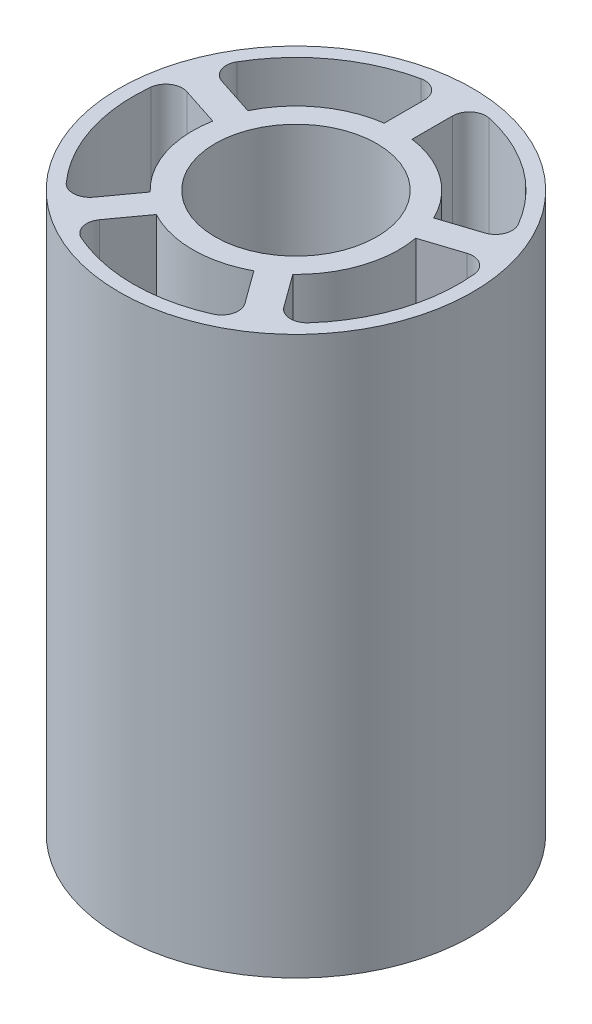
ISO-10303-21;
HEADER;
FILE_DESCRIPTION(('STEP AP214'),'2;1');
FILE_NAME('part.step','',(''),(''),'','','');
FILE_SCHEMA(('AUTOMOTIVE_DESIGN { 1 0 10303 214 1 1 1 1 }'));
ENDSEC;
DATA;
#1=APPLICATION_CONTEXT('core data for automotive mechanical design processes');
#2=APPLICATION_PROTOCOL_DEFINITION('international standard','automotive_design',2000,#1);
#3=PRODUCT_CONTEXT('',#1,'mechanical');
#4=PRODUCT('Part','Part','',(#3));
#5=PRODUCT_RELATED_PRODUCT_CATEGORY('part','',(#4));
#6=PRODUCT_DEFINITION_FORMATION('','',#4);
#7=PRODUCT_DEFINITION_CONTEXT('part definition',#1,'design');
#8=PRODUCT_DEFINITION('design','',#6,#7);
#9=PRODUCT_DEFINITION_SHAPE('','',#8);
#10=(LENGTH_UNIT() NAMED_UNIT(*) SI_UNIT(.MILLI.,.METRE.));
#11=(NAMED_UNIT(*) PLANE_ANGLE_UNIT() SI_UNIT($,.RADIAN.));
#12=(NAMED_UNIT(*) SI_UNIT($,.STERADIAN.) SOLID_ANGLE_UNIT());
#13=UNCERTAINTY_MEASURE_WITH_UNIT(LENGTH_MEASURE(1.E-05),#10,'distance_accuracy_value','');
#14=(GEOMETRIC_REPRESENTATION_CONTEXT(3) GLOBAL_UNCERTAINTY_ASSIGNED_CONTEXT((#13)) GLOBAL_UNIT_ASSIGNED_CONTEXT((#10,
#11,#12)) REPRESENTATION_CONTEXT('',''));
#15=CARTESIAN_POINT('',(0.,0.,0.));
#16=DIRECTION('',(0.,0.,1.));
#17=DIRECTION('',(1.,0.,0.));
#18=AXIS2_PLACEMENT_3D('',#15,#16,#17);
#19=CARTESIAN_POINT('',(0.,100.,0.));
#20=DIRECTION('',(0.,1.,0.));
#21=DIRECTION('',(0.,0.,1.));
#22=AXIS2_PLACEMENT_3D('',#19,#20,#21);
#23=PLANE('',#22);
#24=CARTESIAN_POINT('',(0.,100.,0.));
#25=DIRECTION('',(0.,1.,0.));
#26=DIRECTION('',(0.,0.,1.));
#27=AXIS2_PLACEMENT_3D('',#24,#25,#26);
#28=CIRCLE('',#27,31.685);
#29=CARTESIAN_POINT('',(0.,100.,31.685));
#30=VERTEX_POINT('',#29);
#31=EDGE_CURVE('E11',#30,#30,#28,.T.);
#32=ORIENTED_EDGE('',*,*,#31,.T.);
#33=EDGE_LOOP('',(#32));
#34=FACE_BOUND('',#33,.T.);
#35=CARTESIAN_POINT('',(0.,100.,0.));
#36=DIRECTION('',(0.,1.,0.));
#37=DIRECTION('',(0.,0.,1.));
#38=AXIS2_PLACEMENT_3D('',#35,#36,#37);
#39=CIRCLE('',#38,14.5);
#40=CARTESIAN_POINT('',(0.,100.,14.5));
#41=VERTEX_POINT('',#40);
#42=EDGE_CURVE('E461',#41,#41,#39,.T.);
#43=ORIENTED_EDGE('',*,*,#42,.F.);
#44=EDGE_LOOP('',(#43));
#45=FACE_BOUND('',#44,.T.);
#46=DIRECTION('',(0.951056516295153,0.,-0.309016994374948));
#47=VECTOR('',#46,1.);
#48=CARTESIAN_POINT('',(23.5753258110013,100.,-10.288743261698));
#49=LINE('',#48,#47);
#50=CARTESIAN_POINT('',(16.6606114184768,100.,-8.04201636174165));
#51=VERTEX_POINT('',#50);
#52=CARTESIAN_POINT('',(23.5753258110013,100.,-10.288743261698));
#53=VERTEX_POINT('',#52);
#54=EDGE_CURVE('E418',#51,#53,#49,.T.);
#55=ORIENTED_EDGE('',*,*,#54,.F.);
#56=CARTESIAN_POINT('',(0.,100.,0.));
#57=DIRECTION('',(0.,-1.,0.));
#58=DIRECTION('',(0.,0.,1.));
#59=AXIS2_PLACEMENT_3D('',#56,#57,#58);
#60=CIRCLE('',#59,18.5);
#61=CARTESIAN_POINT('',(2.5,100.,-18.3303027798234));
#62=VERTEX_POINT('',#61);
#63=EDGE_CURVE('E416',#62,#51,#60,.T.);
#64=ORIENTED_EDGE('',*,*,#63,.F.);
#65=DIRECTION('',(0.,0.,1.));
#66=VECTOR('',#65,1.);
#67=CARTESIAN_POINT('',(2.5,100.,-25.6008637549595));
#68=LINE('',#67,#66);
#69=CARTESIAN_POINT('',(2.5,100.,-25.6008637549595));
#70=VERTEX_POINT('',#69);
#71=EDGE_CURVE('E428',#70,#62,#68,.T.);
#72=ORIENTED_EDGE('',*,*,#71,.F.);
#73=CARTESIAN_POINT('',(5.5,100.,-25.6008637549595));
#74=DIRECTION('',(0.,1.,0.));
#75=DIRECTION('',(0.,0.,1.));
#76=AXIS2_PLACEMENT_3D('',#73,#74,#75);
#77=CIRCLE('',#76,3.);
#78=CARTESIAN_POINT('',(6.13013175482146,100.,-28.5339396100246));
#79=VERTEX_POINT('',#78);
#80=EDGE_CURVE('E425',#79,#70,#77,.T.);
#81=ORIENTED_EDGE('',*,*,#80,.F.);
#82=CARTESIAN_POINT('',(0.,100.,0.));
#83=DIRECTION('',(0.,1.,0.));
#84=DIRECTION('',(0.,0.,1.));
#85=AXIS2_PLACEMENT_3D('',#82,#83,#84);
#86=CIRCLE('',#85,29.185);
#87=CARTESIAN_POINT('',(25.2430743116889,100.,-14.6475740071369));
#88=VERTEX_POINT('',#87);
#89=EDGE_CURVE('E423',#88,#79,#86,.T.);
#90=ORIENTED_EDGE('',*,*,#89,.F.);
#91=CARTESIAN_POINT('',(22.6482748278765,100.,-13.1419128105835));
#92=DIRECTION('',(0.,1.,0.));
#93=DIRECTION('',(0.,0.,1.));
#94=AXIS2_PLACEMENT_3D('',#91,#92,#93);
#95=CIRCLE('',#94,3.);
#96=EDGE_CURVE('E421',#53,#88,#95,.T.);
#97=ORIENTED_EDGE('',*,*,#96,.F.);
#98=EDGE_LOOP('',(#55,#64,#72,#81,#90,#97));
#99=FACE_BOUND('',#98,.T.);
#100=DIRECTION('',(0.,0.,-1.));
#101=VECTOR('',#100,1.);
#102=CARTESIAN_POINT('',(-2.5,100.,-25.6008637549595));
#103=LINE('',#102,#101);
#104=CARTESIAN_POINT('',(-2.5,100.,-18.3303027798234));
#105=VERTEX_POINT('',#104);
#106=CARTESIAN_POINT('',(-2.5,100.,-25.6008637549595));
#107=VERTEX_POINT('',#106);
#108=EDGE_CURVE('E373',#105,#107,#103,.T.);
#109=ORIENTED_EDGE('',*,*,#108,.F.);
#110=CARTESIAN_POINT('',(0.,100.,0.));
#111=DIRECTION('',(0.,-1.,0.));
#112=DIRECTION('',(0.,0.,1.));
#113=AXIS2_PLACEMENT_3D('',#110,#111,#112);
#114=CIRCLE('',#113,18.5);
#115=CARTESIAN_POINT('',(-16.6606114184768,100.,-8.04201636174164));
#116=VERTEX_POINT('',#115);
#117=EDGE_CURVE('E371',#116,#105,#114,.T.);
#118=ORIENTED_EDGE('',*,*,#117,.F.);
#119=DIRECTION('',(0.951056516295154,0.,0.309016994374947));
#120=VECTOR('',#119,1.);
#121=CARTESIAN_POINT('',(-23.5753258110013,100.,-10.288743261698));
#122=LINE('',#121,#120);
#123=CARTESIAN_POINT('',(-23.5753258110013,100.,-10.288743261698));
#124=VERTEX_POINT('',#123);
#125=EDGE_CURVE('E383',#124,#116,#122,.T.);
#126=ORIENTED_EDGE('',*,*,#125,.F.);
#127=CARTESIAN_POINT('',(-22.6482748278765,100.,-13.1419128105835));
#128=DIRECTION('',(0.,1.,0.));
#129=DIRECTION('',(0.,0.,-1.));
#130=AXIS2_PLACEMENT_3D('',#127,#128,#129);
#131=CIRCLE('',#130,3.);
#132=CARTESIAN_POINT('',(-25.2430743116889,100.,-14.6475740071368));
#133=VERTEX_POINT('',#132);
#134=EDGE_CURVE('E380',#133,#124,#131,.T.);
#135=ORIENTED_EDGE('',*,*,#134,.F.);
#136=CARTESIAN_POINT('',(0.,100.,0.));
#137=DIRECTION('',(0.,1.,0.));
#138=DIRECTION('',(0.,0.,1.));
#139=AXIS2_PLACEMENT_3D('',#136,#137,#138);
#140=CIRCLE('',#139,29.185);
#141=CARTESIAN_POINT('',(-6.13013175482147,100.,-28.5339396100246));
#142=VERTEX_POINT('',#141);
#143=EDGE_CURVE('E378',#142,#133,#140,.T.);
#144=ORIENTED_EDGE('',*,*,#143,.F.);
#145=CARTESIAN_POINT('',(-5.5,100.,-25.6008637549595));
#146=DIRECTION('',(0.,1.,0.));
#147=DIRECTION('',(0.,0.,-1.));
#148=AXIS2_PLACEMENT_3D('',#145,#146,#147);
#149=CIRCLE('',#148,3.);
#150=EDGE_CURVE('E376',#107,#142,#149,.T.);
#151=ORIENTED_EDGE('',*,*,#150,.F.);
#152=EDGE_LOOP('',(#109,#118,#126,#135,#144,#151));
#153=FACE_BOUND('',#152,.T.);
#154=DIRECTION('',(0.587785252292473,0.,0.809016994374947));
#155=VECTOR('',#154,1.);
#156=CARTESIAN_POINT('',(17.0703526470515,100.,19.2420707177087));
#157=LINE('',#156,#155);
#158=CARTESIAN_POINT('',(12.7968241299733,100.,13.3600633301843));
#159=VERTEX_POINT('',#158);
#160=CARTESIAN_POINT('',(17.0703526470515,100.,19.2420707177087));
#161=VERTEX_POINT('',#160);
#162=EDGE_CURVE('E328',#159,#161,#157,.T.);
#163=ORIENTED_EDGE('',*,*,#162,.F.);
#164=CARTESIAN_POINT('',(0.,100.,0.));
#165=DIRECTION('',(0.,-1.,0.));
#166=DIRECTION('',(0.,0.,1.));
#167=AXIS2_PLACEMENT_3D('',#164,#165,#166);
#168=CIRCLE('',#167,18.5);
#169=CARTESIAN_POINT('',(18.2056963903515,100.,-3.28673378026588));
#170=VERTEX_POINT('',#169);
#171=EDGE_CURVE('E326',#170,#159,#168,.T.);
#172=ORIENTED_EDGE('',*,*,#171,.F.);
#173=DIRECTION('',(-0.951056516295153,0.,0.309016994374948));
#174=VECTOR('',#173,1.);
#175=CARTESIAN_POINT('',(25.120410782876,100.,-5.53346068022224));
#176=LINE('',#175,#174);
#177=CARTESIAN_POINT('',(25.120410782876,100.,-5.53346068022224));
#178=VERTEX_POINT('',#177);
#179=EDGE_CURVE('E338',#178,#170,#176,.T.);
#180=ORIENTED_EDGE('',*,*,#179,.F.);
#181=CARTESIAN_POINT('',(26.0474617660009,100.,-2.68029113133678));
#182=DIRECTION('',(0.,1.,0.));
#183=DIRECTION('',(0.,0.,-1.));
#184=AXIS2_PLACEMENT_3D('',#181,#182,#183);
#185=CIRCLE('',#184,3.);
#186=CARTESIAN_POINT('',(29.0317040916836,100.,-2.98737050479526));
#187=VERTEX_POINT('',#186);
#188=EDGE_CURVE('E335',#187,#178,#185,.T.);
#189=ORIENTED_EDGE('',*,*,#188,.F.);
#190=CARTESIAN_POINT('',(0.,100.,0.));
#191=DIRECTION('',(0.,1.,0.));
#192=DIRECTION('',(0.,0.,1.));
#193=AXIS2_PLACEMENT_3D('',#190,#191,#192);
#194=CIRCLE('',#193,29.185);
#195=CARTESIAN_POINT('',(21.7312096599846,100.,19.4812410208845));
#196=VERTEX_POINT('',#195);
#197=EDGE_CURVE('E333',#196,#187,#194,.T.);
#198=ORIENTED_EDGE('',*,*,#197,.F.);
#199=CARTESIAN_POINT('',(19.4974036301763,100.,17.4787149608313));
#200=DIRECTION('',(0.,1.,0.));
#201=DIRECTION('',(0.,0.,1.));
#202=AXIS2_PLACEMENT_3D('',#199,#200,#201);
#203=CIRCLE('',#202,3.);
#204=EDGE_CURVE('E331',#161,#196,#203,.T.);
#205=ORIENTED_EDGE('',*,*,#204,.F.);
#206=EDGE_LOOP('',(#163,#172,#180,#189,#198,#205));
#207=FACE_BOUND('',#206,.T.);
#208=CARTESIAN_POINT('',(0.,100.,0.));
#209=DIRECTION('',(0.,1.,0.));
#210=DIRECTION('',(0.,0.,1.));
#211=AXIS2_PLACEMENT_3D('',#208,#209,#210);
#212=CIRCLE('',#211,29.185);
#213=CARTESIAN_POINT('',(-29.0317040916836,100.,-2.98737050479526));
#214=VERTEX_POINT('',#213);
#215=CARTESIAN_POINT('',(-21.7312096599846,100.,19.4812410208845));
#216=VERTEX_POINT('',#215);
#217=EDGE_CURVE('E283',#214,#216,#212,.T.);
#218=ORIENTED_EDGE('',*,*,#217,.F.);
#219=CARTESIAN_POINT('',(-26.0474617660009,100.,-2.68029113133677));
#220=DIRECTION('',(0.,1.,0.));
#221=DIRECTION('',(0.,0.,1.));
#222=AXIS2_PLACEMENT_3D('',#219,#220,#221);
#223=CIRCLE('',#222,3.);
#224=CARTESIAN_POINT('',(-25.120410782876,100.,-5.53346068022223));
#225=VERTEX_POINT('',#224);
#226=EDGE_CURVE('E281',#225,#214,#223,.T.);
#227=ORIENTED_EDGE('',*,*,#226,.F.);
#228=DIRECTION('',(-0.951056516295154,0.,-0.309016994374947));
#229=VECTOR('',#228,1.);
#230=CARTESIAN_POINT('',(-25.120410782876,100.,-5.53346068022223));
#231=LINE('',#230,#229);
#232=CARTESIAN_POINT('',(-18.2056963903515,100.,-3.28673378026587));
#233=VERTEX_POINT('',#232);
#234=EDGE_CURVE('E293',#233,#225,#231,.T.);
#235=ORIENTED_EDGE('',*,*,#234,.F.);
#236=CARTESIAN_POINT('',(0.,100.,0.));
#237=DIRECTION('',(0.,-1.,0.));
#238=DIRECTION('',(0.,0.,1.));
#239=AXIS2_PLACEMENT_3D('',#236,#237,#238);
#240=CIRCLE('',#239,18.5);
#241=CARTESIAN_POINT('',(-12.7968241299733,100.,13.3600633301843));
#242=VERTEX_POINT('',#241);
#243=EDGE_CURVE('E290',#242,#233,#240,.T.);
#244=ORIENTED_EDGE('',*,*,#243,.F.);
#245=DIRECTION('',(0.587785252292473,0.,-0.809016994374948));
#246=VECTOR('',#245,1.);
#247=CARTESIAN_POINT('',(-17.0703526470515,100.,19.2420707177087));
#248=LINE('',#247,#246);
#249=CARTESIAN_POINT('',(-17.0703526470515,100.,19.2420707177087));
#250=VERTEX_POINT('',#249);
#251=EDGE_CURVE('E288',#250,#242,#248,.T.);
#252=ORIENTED_EDGE('',*,*,#251,.F.);
#253=CARTESIAN_POINT('',(-19.4974036301763,100.,17.4787149608313));
#254=DIRECTION('',(0.,1.,0.));
#255=DIRECTION('',(0.,0.,-1.));
#256=AXIS2_PLACEMENT_3D('',#253,#254,#255);
#257=CIRCLE('',#256,3.);
#258=EDGE_CURVE('E286',#216,#250,#257,.T.);
#259=ORIENTED_EDGE('',*,*,#258,.F.);
#260=EDGE_LOOP('',(#218,#227,#235,#244,#252,#259));
#261=FACE_BOUND('',#260,.T.);
#262=DIRECTION('',(-0.587785252292473,0.,0.809016994374948));
#263=VECTOR('',#262,1.);
#264=CARTESIAN_POINT('',(-13.0252676751767,100.,22.1809969791711));
#265=LINE('',#264,#263);
#266=CARTESIAN_POINT('',(-8.75173915809853,100.,16.2989895916466));
#267=VERTEX_POINT('',#266);
#268=CARTESIAN_POINT('',(-13.0252676751767,100.,22.1809969791711));
#269=VERTEX_POINT('',#268);
#270=EDGE_CURVE('E238',#267,#269,#265,.T.);
#271=ORIENTED_EDGE('',*,*,#270,.F.);
#272=CARTESIAN_POINT('',(0.,100.,0.));
#273=DIRECTION('',(0.,-1.,0.));
#274=DIRECTION('',(0.,0.,1.));
#275=AXIS2_PLACEMENT_3D('',#272,#273,#274);
#276=CIRCLE('',#275,18.5);
#277=CARTESIAN_POINT('',(8.75173915809853,100.,16.2989895916466));
#278=VERTEX_POINT('',#277);
#279=EDGE_CURVE('E230',#278,#267,#276,.T.);
#280=ORIENTED_EDGE('',*,*,#279,.F.);
#281=DIRECTION('',(-0.587785252292473,0.,-0.809016994374947));
#282=VECTOR('',#281,1.);
#283=CARTESIAN_POINT('',(13.0252676751767,100.,22.1809969791711));
#284=LINE('',#283,#282);
#285=CARTESIAN_POINT('',(13.0252676751767,100.,22.1809969791711));
#286=VERTEX_POINT('',#285);
#287=EDGE_CURVE('E259',#286,#278,#284,.T.);
#288=ORIENTED_EDGE('',*,*,#287,.F.);
#289=CARTESIAN_POINT('',(10.5982166920519,100.,23.9443527360485));
#290=DIRECTION('',(0.,1.,0.));
#291=DIRECTION('',(0.,0.,-1.));
#292=AXIS2_PLACEMENT_3D('',#289,#290,#291);
#293=CIRCLE('',#292,3.);
#294=CARTESIAN_POINT('',(11.8124481251684,100.,26.6876431010722));
#295=VERTEX_POINT('',#294);
#296=EDGE_CURVE('E257',#295,#286,#293,.T.);
#297=ORIENTED_EDGE('',*,*,#296,.F.);
#298=CARTESIAN_POINT('',(0.,100.,0.));
#299=DIRECTION('',(0.,1.,0.));
#300=DIRECTION('',(0.,0.,1.));
#301=AXIS2_PLACEMENT_3D('',#298,#299,#300);
#302=CIRCLE('',#301,29.185);
#303=CARTESIAN_POINT('',(-11.8124481251684,100.,26.6876431010722));
#304=VERTEX_POINT('',#303);
#305=EDGE_CURVE('E253',#304,#295,#302,.T.);
#306=ORIENTED_EDGE('',*,*,#305,.F.);
#307=CARTESIAN_POINT('',(-10.5982166920519,100.,23.9443527360485));
#308=DIRECTION('',(0.,1.,0.));
#309=DIRECTION('',(0.,0.,1.));
#310=AXIS2_PLACEMENT_3D('',#307,#308,#309);
#311=CIRCLE('',#310,3.);
#312=EDGE_CURVE('E251',#269,#304,#311,.T.);
#313=ORIENTED_EDGE('',*,*,#312,.F.);
#314=EDGE_LOOP('',(#271,#280,#288,#297,#306,#313));
#315=FACE_BOUND('',#314,.T.);
#316=ADVANCED_FACE('F33',(#34,#45,#99,#153,#207,#261,#315),#23,.T.);
#317=CARTESIAN_POINT('',(0.,0.,0.));
#318=DIRECTION('',(0.,1.,0.));
#319=DIRECTION('',(0.,0.,1.));
#320=AXIS2_PLACEMENT_3D('',#317,#318,#319);
#321=PLANE('',#320);
#322=CARTESIAN_POINT('',(-26.0474617660009,0.,-2.68029113133677));
#323=DIRECTION('',(0.,1.,0.));
#324=DIRECTION('',(0.,0.,1.));
#325=AXIS2_PLACEMENT_3D('',#322,#323,#324);
#326=CIRCLE('',#325,3.);
#327=CARTESIAN_POINT('',(-25.120410782876,0.,-5.53346068022223));
#328=VERTEX_POINT('',#327);
#329=CARTESIAN_POINT('',(-29.0317040916836,0.,-2.98737050479526));
#330=VERTEX_POINT('',#329);
#331=EDGE_CURVE('E246',#328,#330,#326,.T.);
#332=ORIENTED_EDGE('',*,*,#331,.T.);
#333=CARTESIAN_POINT('',(0.,0.,0.));
#334=DIRECTION('',(0.,1.,0.));
#335=DIRECTION('',(0.,0.,1.));
#336=AXIS2_PLACEMENT_3D('',#333,#334,#335);
#337=CIRCLE('',#336,29.185);
#338=CARTESIAN_POINT('',(-21.7312096599846,0.,19.4812410208845));
#339=VERTEX_POINT('',#338);
#340=EDGE_CURVE('E298',#330,#339,#337,.T.);
#341=ORIENTED_EDGE('',*,*,#340,.T.);
#342=CARTESIAN_POINT('',(-19.4974036301763,0.,17.4787149608313));
#343=DIRECTION('',(0.,1.,0.));
#344=DIRECTION('',(0.,0.,-1.));
#345=AXIS2_PLACEMENT_3D('',#342,#343,#344);
#346=CIRCLE('',#345,3.);
#347=CARTESIAN_POINT('',(-17.0703526470515,0.,19.2420707177087));
#348=VERTEX_POINT('',#347);
#349=EDGE_CURVE('E301',#339,#348,#346,.T.);
#350=ORIENTED_EDGE('',*,*,#349,.T.);
#351=DIRECTION('',(0.587785252292473,0.,-0.809016994374948));
#352=VECTOR('',#351,1.);
#353=CARTESIAN_POINT('',(-17.0703526470515,0.,19.2420707177087));
#354=LINE('',#353,#352);
#355=CARTESIAN_POINT('',(-12.7968241299733,0.,13.3600633301843));
#356=VERTEX_POINT('',#355);
#357=EDGE_CURVE('E304',#348,#356,#354,.T.);
#358=ORIENTED_EDGE('',*,*,#357,.T.);
#359=CARTESIAN_POINT('',(0.,0.,0.));
#360=DIRECTION('',(0.,-1.,0.));
#361=DIRECTION('',(0.,0.,1.));
#362=AXIS2_PLACEMENT_3D('',#359,#360,#361);
#363=CIRCLE('',#362,18.5);
#364=CARTESIAN_POINT('',(-18.2056963903515,0.,-3.28673378026587));
#365=VERTEX_POINT('',#364);
#366=EDGE_CURVE('E307',#356,#365,#363,.T.);
#367=ORIENTED_EDGE('',*,*,#366,.T.);
#368=DIRECTION('',(-0.951056516295154,0.,-0.309016994374947));
#369=VECTOR('',#368,1.);
#370=CARTESIAN_POINT('',(-25.120410782876,0.,-5.53346068022223));
#371=LINE('',#370,#369);
#372=EDGE_CURVE('E284',#365,#328,#371,.T.);
#373=ORIENTED_EDGE('',*,*,#372,.T.);
#374=EDGE_LOOP('',(#332,#341,#350,#358,#367,#373));
#375=FACE_BOUND('',#374,.T.);
#376=CARTESIAN_POINT('',(0.,0.,0.));
#377=DIRECTION('',(0.,-1.,0.));
#378=DIRECTION('',(0.,0.,1.));
#379=AXIS2_PLACEMENT_3D('',#376,#377,#378);
#380=CIRCLE('',#379,18.5);
#381=CARTESIAN_POINT('',(-16.6606114184768,0.,-8.04201636174164));
#382=VERTEX_POINT('',#381);
#383=CARTESIAN_POINT('',(-2.5,0.,-18.3303027798234));
#384=VERTEX_POINT('',#383);
#385=EDGE_CURVE('E370',#382,#384,#380,.T.);
#386=ORIENTED_EDGE('',*,*,#385,.T.);
#387=DIRECTION('',(0.,0.,-1.));
#388=VECTOR('',#387,1.);
#389=CARTESIAN_POINT('',(-2.5,0.,-25.6008637549595));
#390=LINE('',#389,#388);
#391=CARTESIAN_POINT('',(-2.5,0.,-25.6008637549595));
#392=VERTEX_POINT('',#391);
#393=EDGE_CURVE('E388',#384,#392,#390,.T.);
#394=ORIENTED_EDGE('',*,*,#393,.T.);
#395=CARTESIAN_POINT('',(-5.5,0.,-25.6008637549595));
#396=DIRECTION('',(0.,1.,0.));
#397=DIRECTION('',(0.,0.,-1.));
#398=AXIS2_PLACEMENT_3D('',#395,#396,#397);
#399=CIRCLE('',#398,3.);
#400=CARTESIAN_POINT('',(-6.13013175482147,0.,-28.5339396100246));
#401=VERTEX_POINT('',#400);
#402=EDGE_CURVE('E391',#392,#401,#399,.T.);
#403=ORIENTED_EDGE('',*,*,#402,.T.);
#404=CARTESIAN_POINT('',(0.,0.,0.));
#405=DIRECTION('',(0.,1.,0.));
#406=DIRECTION('',(0.,0.,1.));
#407=AXIS2_PLACEMENT_3D('',#404,#405,#406);
#408=CIRCLE('',#407,29.185);
#409=CARTESIAN_POINT('',(-25.2430743116889,0.,-14.6475740071368));
#410=VERTEX_POINT('',#409);
#411=EDGE_CURVE('E394',#401,#410,#408,.T.);
#412=ORIENTED_EDGE('',*,*,#411,.T.);
#413=CARTESIAN_POINT('',(-22.6482748278765,0.,-13.1419128105835));
#414=DIRECTION('',(0.,1.,0.));
#415=DIRECTION('',(0.,0.,-1.));
#416=AXIS2_PLACEMENT_3D('',#413,#414,#415);
#417=CIRCLE('',#416,3.);
#418=CARTESIAN_POINT('',(-23.5753258110013,0.,-10.288743261698));
#419=VERTEX_POINT('',#418);
#420=EDGE_CURVE('E397',#410,#419,#417,.T.);
#421=ORIENTED_EDGE('',*,*,#420,.T.);
#422=DIRECTION('',(0.951056516295154,0.,0.309016994374947));
#423=VECTOR('',#422,1.);
#424=CARTESIAN_POINT('',(-23.5753258110013,0.,-10.288743261698));
#425=LINE('',#424,#423);
#426=EDGE_CURVE('E374',#419,#382,#425,.T.);
#427=ORIENTED_EDGE('',*,*,#426,.T.);
#428=EDGE_LOOP('',(#386,#394,#403,#412,#421,#427));
#429=FACE_BOUND('',#428,.T.);
#430=CARTESIAN_POINT('',(0.,0.,0.));
#431=DIRECTION('',(0.,1.,0.));
#432=DIRECTION('',(0.,0.,1.));
#433=AXIS2_PLACEMENT_3D('',#430,#431,#432);
#434=CIRCLE('',#433,14.5);
#435=CARTESIAN_POINT('',(0.,0.,14.5));
#436=VERTEX_POINT('',#435);
#437=EDGE_CURVE('E460',#436,#436,#434,.T.);
#438=ORIENTED_EDGE('',*,*,#437,.T.);
#439=EDGE_LOOP('',(#438));
#440=FACE_BOUND('',#439,.T.);
#441=CARTESIAN_POINT('',(0.,0.,0.));
#442=DIRECTION('',(0.,1.,0.));
#443=DIRECTION('',(0.,0.,1.));
#444=AXIS2_PLACEMENT_3D('',#441,#442,#443);
#445=CIRCLE('',#444,31.685);
#446=CARTESIAN_POINT('',(0.,0.,31.685));
#447=VERTEX_POINT('',#446);
#448=EDGE_CURVE('E37',#447,#447,#445,.T.);
#449=ORIENTED_EDGE('',*,*,#448,.F.);
#450=EDGE_LOOP('',(#449));
#451=FACE_BOUND('',#450,.T.);
#452=CARTESIAN_POINT('',(0.,0.,0.));
#453=DIRECTION('',(0.,-1.,0.));
#454=DIRECTION('',(0.,0.,1.));
#455=AXIS2_PLACEMENT_3D('',#452,#453,#454);
#456=CIRCLE('',#455,18.5);
#457=CARTESIAN_POINT('',(2.5,0.,-18.3303027798234));
#458=VERTEX_POINT('',#457);
#459=CARTESIAN_POINT('',(16.6606114184768,0.,-8.04201636174165));
#460=VERTEX_POINT('',#459);
#461=EDGE_CURVE('E415',#458,#460,#456,.T.);
#462=ORIENTED_EDGE('',*,*,#461,.T.);
#463=DIRECTION('',(0.951056516295153,0.,-0.309016994374948));
#464=VECTOR('',#463,1.);
#465=CARTESIAN_POINT('',(23.5753258110013,0.,-10.288743261698));
#466=LINE('',#465,#464);
#467=CARTESIAN_POINT('',(23.5753258110013,0.,-10.288743261698));
#468=VERTEX_POINT('',#467);
#469=EDGE_CURVE('E433',#460,#468,#466,.T.);
#470=ORIENTED_EDGE('',*,*,#469,.T.);
#471=CARTESIAN_POINT('',(22.6482748278765,0.,-13.1419128105835));
#472=DIRECTION('',(0.,1.,0.));
#473=DIRECTION('',(0.,0.,1.));
#474=AXIS2_PLACEMENT_3D('',#471,#472,#473);
#475=CIRCLE('',#474,3.);
#476=CARTESIAN_POINT('',(25.2430743116889,0.,-14.6475740071369));
#477=VERTEX_POINT('',#476);
#478=EDGE_CURVE('E436',#468,#477,#475,.T.);
#479=ORIENTED_EDGE('',*,*,#478,.T.);
#480=CARTESIAN_POINT('',(0.,0.,0.));
#481=DIRECTION('',(0.,1.,0.));
#482=DIRECTION('',(0.,0.,1.));
#483=AXIS2_PLACEMENT_3D('',#480,#481,#482);
#484=CIRCLE('',#483,29.185);
#485=CARTESIAN_POINT('',(6.13013175482146,0.,-28.5339396100246));
#486=VERTEX_POINT('',#485);
#487=EDGE_CURVE('E439',#477,#486,#484,.T.);
#488=ORIENTED_EDGE('',*,*,#487,.T.);
#489=CARTESIAN_POINT('',(5.5,0.,-25.6008637549595));
#490=DIRECTION('',(0.,1.,0.));
#491=DIRECTION('',(0.,0.,1.));
#492=AXIS2_PLACEMENT_3D('',#489,#490,#491);
#493=CIRCLE('',#492,3.);
#494=CARTESIAN_POINT('',(2.5,0.,-25.6008637549595));
#495=VERTEX_POINT('',#494);
#496=EDGE_CURVE('E442',#486,#495,#493,.T.);
#497=ORIENTED_EDGE('',*,*,#496,.T.);
#498=DIRECTION('',(0.,0.,1.));
#499=VECTOR('',#498,1.);
#500=CARTESIAN_POINT('',(2.5,0.,-25.6008637549595));
#501=LINE('',#500,#499);
#502=EDGE_CURVE('E419',#495,#458,#501,.T.);
#503=ORIENTED_EDGE('',*,*,#502,.T.);
#504=EDGE_LOOP('',(#462,#470,#479,#488,#497,#503));
#505=FACE_BOUND('',#504,.T.);
#506=CARTESIAN_POINT('',(0.,0.,0.));
#507=DIRECTION('',(0.,-1.,0.));
#508=DIRECTION('',(0.,0.,1.));
#509=AXIS2_PLACEMENT_3D('',#506,#507,#508);
#510=CIRCLE('',#509,18.5);
#511=CARTESIAN_POINT('',(18.2056963903515,0.,-3.28673378026588));
#512=VERTEX_POINT('',#511);
#513=CARTESIAN_POINT('',(12.7968241299733,0.,13.3600633301843));
#514=VERTEX_POINT('',#513);
#515=EDGE_CURVE('E325',#512,#514,#510,.T.);
#516=ORIENTED_EDGE('',*,*,#515,.T.);
#517=DIRECTION('',(0.587785252292473,0.,0.809016994374947));
#518=VECTOR('',#517,1.);
#519=CARTESIAN_POINT('',(17.0703526470515,0.,19.2420707177087));
#520=LINE('',#519,#518);
#521=CARTESIAN_POINT('',(17.0703526470515,0.,19.2420707177087));
#522=VERTEX_POINT('',#521);
#523=EDGE_CURVE('E343',#514,#522,#520,.T.);
#524=ORIENTED_EDGE('',*,*,#523,.T.);
#525=CARTESIAN_POINT('',(19.4974036301763,0.,17.4787149608313));
#526=DIRECTION('',(0.,1.,0.));
#527=DIRECTION('',(0.,0.,1.));
#528=AXIS2_PLACEMENT_3D('',#525,#526,#527);
#529=CIRCLE('',#528,3.);
#530=CARTESIAN_POINT('',(21.7312096599846,0.,19.4812410208845));
#531=VERTEX_POINT('',#530);
#532=EDGE_CURVE('E346',#522,#531,#529,.T.);
#533=ORIENTED_EDGE('',*,*,#532,.T.);
#534=CARTESIAN_POINT('',(0.,0.,0.));
#535=DIRECTION('',(0.,1.,0.));
#536=DIRECTION('',(0.,0.,1.));
#537=AXIS2_PLACEMENT_3D('',#534,#535,#536);
#538=CIRCLE('',#537,29.185);
#539=CARTESIAN_POINT('',(29.0317040916836,0.,-2.98737050479526));
#540=VERTEX_POINT('',#539);
#541=EDGE_CURVE('E349',#531,#540,#538,.T.);
#542=ORIENTED_EDGE('',*,*,#541,.T.);
#543=CARTESIAN_POINT('',(26.0474617660009,0.,-2.68029113133678));
#544=DIRECTION('',(0.,1.,0.));
#545=DIRECTION('',(0.,0.,-1.));
#546=AXIS2_PLACEMENT_3D('',#543,#544,#545);
#547=CIRCLE('',#546,3.);
#548=CARTESIAN_POINT('',(25.120410782876,0.,-5.53346068022224));
#549=VERTEX_POINT('',#548);
#550=EDGE_CURVE('E352',#540,#549,#547,.T.);
#551=ORIENTED_EDGE('',*,*,#550,.T.);
#552=DIRECTION('',(-0.951056516295153,0.,0.309016994374948));
#553=VECTOR('',#552,1.);
#554=CARTESIAN_POINT('',(25.120410782876,0.,-5.53346068022224));
#555=LINE('',#554,#553);
#556=EDGE_CURVE('E329',#549,#512,#555,.T.);
#557=ORIENTED_EDGE('',*,*,#556,.T.);
#558=EDGE_LOOP('',(#516,#524,#533,#542,#551,#557));
#559=FACE_BOUND('',#558,.T.);
#560=CARTESIAN_POINT('',(0.,0.,0.));
#561=DIRECTION('',(0.,-1.,0.));
#562=DIRECTION('',(0.,0.,1.));
#563=AXIS2_PLACEMENT_3D('',#560,#561,#562);
#564=CIRCLE('',#563,18.5);
#565=CARTESIAN_POINT('',(8.75173915809853,0.,16.2989895916466));
#566=VERTEX_POINT('',#565);
#567=CARTESIAN_POINT('',(-8.75173915809853,0.,16.2989895916466));
#568=VERTEX_POINT('',#567);
#569=EDGE_CURVE('E56',#566,#568,#564,.T.);
#570=ORIENTED_EDGE('',*,*,#569,.T.);
#571=DIRECTION('',(-0.587785252292473,0.,0.809016994374948));
#572=VECTOR('',#571,1.);
#573=CARTESIAN_POINT('',(-13.0252676751767,0.,22.1809969791711));
#574=LINE('',#573,#572);
#575=CARTESIAN_POINT('',(-13.0252676751767,0.,22.1809969791711));
#576=VERTEX_POINT('',#575);
#577=EDGE_CURVE('E245',#568,#576,#574,.T.);
#578=ORIENTED_EDGE('',*,*,#577,.T.);
#579=CARTESIAN_POINT('',(-10.5982166920519,0.,23.9443527360485));
#580=DIRECTION('',(0.,1.,0.));
#581=DIRECTION('',(0.,0.,1.));
#582=AXIS2_PLACEMENT_3D('',#579,#580,#581);
#583=CIRCLE('',#582,3.);
#584=CARTESIAN_POINT('',(-11.8124481251684,0.,26.6876431010722));
#585=VERTEX_POINT('',#584);
#586=EDGE_CURVE('E263',#576,#585,#583,.T.);
#587=ORIENTED_EDGE('',*,*,#586,.T.);
#588=CARTESIAN_POINT('',(0.,0.,0.));
#589=DIRECTION('',(0.,1.,0.));
#590=DIRECTION('',(0.,0.,1.));
#591=AXIS2_PLACEMENT_3D('',#588,#589,#590);
#592=CIRCLE('',#591,29.185);
#593=CARTESIAN_POINT('',(11.8124481251684,0.,26.6876431010722));
#594=VERTEX_POINT('',#593);
#595=EDGE_CURVE('E266',#585,#594,#592,.T.);
#596=ORIENTED_EDGE('',*,*,#595,.T.);
#597=CARTESIAN_POINT('',(10.5982166920519,0.,23.9443527360485));
#598=DIRECTION('',(0.,1.,0.));
#599=DIRECTION('',(0.,0.,-1.));
#600=AXIS2_PLACEMENT_3D('',#597,#598,#599);
#601=CIRCLE('',#600,3.);
#602=CARTESIAN_POINT('',(13.0252676751767,0.,22.1809969791711));
#603=VERTEX_POINT('',#602);
#604=EDGE_CURVE('E269',#594,#603,#601,.T.);
#605=ORIENTED_EDGE('',*,*,#604,.T.);
#606=DIRECTION('',(-0.587785252292473,0.,-0.809016994374947));
#607=VECTOR('',#606,1.);
#608=CARTESIAN_POINT('',(13.0252676751767,0.,22.1809969791711));
#609=LINE('',#608,#607);
#610=EDGE_CURVE('E239',#603,#566,#609,.T.);
#611=ORIENTED_EDGE('',*,*,#610,.T.);
#612=EDGE_LOOP('',(#570,#578,#587,#596,#605,#611));
#613=FACE_BOUND('',#612,.T.);
#614=ADVANCED_FACE('F467',(#375,#429,#440,#451,#505,#559,#613),#321,.F.);
#615=CARTESIAN_POINT('',(0.,100.,0.));
#616=DIRECTION('',(0.,-1.,0.));
#617=DIRECTION('',(0.,0.,-1.));
#618=AXIS2_PLACEMENT_3D('',#615,#616,#617);
#619=CYLINDRICAL_SURFACE('',#618,31.685);
#620=ORIENTED_EDGE('',*,*,#31,.F.);
#621=EDGE_LOOP('',(#620));
#622=FACE_BOUND('',#621,.T.);
#623=ORIENTED_EDGE('',*,*,#448,.T.);
#624=EDGE_LOOP('',(#623));
#625=FACE_BOUND('',#624,.T.);
#626=ADVANCED_FACE('F35',(#622,#625),#619,.T.);
#627=CARTESIAN_POINT('',(0.,100.,0.));
#628=DIRECTION('',(0.,-1.,0.));
#629=DIRECTION('',(0.,0.,-1.));
#630=AXIS2_PLACEMENT_3D('',#627,#628,#629);
#631=CYLINDRICAL_SURFACE('',#630,14.5);
#632=ORIENTED_EDGE('',*,*,#42,.T.);
#633=EDGE_LOOP('',(#632));
#634=FACE_BOUND('',#633,.T.);
#635=ORIENTED_EDGE('',*,*,#437,.F.);
#636=EDGE_LOOP('',(#635));
#637=FACE_BOUND('',#636,.T.);
#638=ADVANCED_FACE('F470',(#634,#637),#631,.F.);
#639=CARTESIAN_POINT('',(0.,100.,0.));
#640=DIRECTION('',(0.,-1.,0.));
#641=DIRECTION('',(0.,0.,-1.));
#642=AXIS2_PLACEMENT_3D('',#639,#640,#641);
#643=CYLINDRICAL_SURFACE('',#642,18.5);
#644=ORIENTED_EDGE('',*,*,#461,.F.);
#645=DIRECTION('',(0.,-1.,0.));
#646=VECTOR('',#645,1.);
#647=CARTESIAN_POINT('',(2.5,100.,-18.3303027798234));
#648=LINE('',#647,#646);
#649=EDGE_CURVE('E430',#62,#458,#648,.T.);
#650=ORIENTED_EDGE('',*,*,#649,.F.);
#651=ORIENTED_EDGE('',*,*,#63,.T.);
#652=DIRECTION('',(0.,-1.,0.));
#653=VECTOR('',#652,1.);
#654=CARTESIAN_POINT('',(16.6606114184768,100.,-8.04201636174165));
#655=LINE('',#654,#653);
#656=EDGE_CURVE('E457',#51,#460,#655,.T.);
#657=ORIENTED_EDGE('',*,*,#656,.T.);
#658=EDGE_LOOP('',(#644,#650,#651,#657));
#659=FACE_BOUND('',#658,.T.);
#660=ADVANCED_FACE('F472',(#659),#643,.T.);
#661=CARTESIAN_POINT('',(23.5753258110013,100.,-10.288743261698));
#662=DIRECTION('',(-0.309016994374948,0.,-0.951056516295153));
#663=DIRECTION('',(-0.951056516295153,0.,0.309016994374948));
#664=AXIS2_PLACEMENT_3D('',#661,#662,#663);
#665=PLANE('',#664);
#666=ORIENTED_EDGE('',*,*,#469,.F.);
#667=ORIENTED_EDGE('',*,*,#656,.F.);
#668=ORIENTED_EDGE('',*,*,#54,.T.);
#669=DIRECTION('',(0.,-1.,0.));
#670=VECTOR('',#669,1.);
#671=CARTESIAN_POINT('',(23.5753258110013,100.,-10.288743261698));
#672=LINE('',#671,#670);
#673=EDGE_CURVE('E455',#53,#468,#672,.T.);
#674=ORIENTED_EDGE('',*,*,#673,.T.);
#675=EDGE_LOOP('',(#666,#667,#668,#674));
#676=FACE_BOUND('',#675,.T.);
#677=ADVANCED_FACE('F479',(#676),#665,.T.);
#678=CARTESIAN_POINT('',(22.6482748278765,100.,-13.1419128105835));
#679=DIRECTION('',(0.,-1.,0.));
#680=DIRECTION('',(0.,0.,-1.));
#681=AXIS2_PLACEMENT_3D('',#678,#679,#680);
#682=CYLINDRICAL_SURFACE('',#681,3.);
#683=ORIENTED_EDGE('',*,*,#478,.F.);
#684=ORIENTED_EDGE('',*,*,#673,.F.);
#685=ORIENTED_EDGE('',*,*,#96,.T.);
#686=DIRECTION('',(0.,-1.,0.));
#687=VECTOR('',#686,1.);
#688=CARTESIAN_POINT('',(25.2430743116889,100.,-14.6475740071369));
#689=LINE('',#688,#687);
#690=EDGE_CURVE('E453',#88,#477,#689,.T.);
#691=ORIENTED_EDGE('',*,*,#690,.T.);
#692=EDGE_LOOP('',(#683,#684,#685,#691));
#693=FACE_BOUND('',#692,.T.);
#694=ADVANCED_FACE('F607',(#693),#682,.F.);
#695=CARTESIAN_POINT('',(0.,100.,0.));
#696=DIRECTION('',(0.,-1.,0.));
#697=DIRECTION('',(0.,0.,-1.));
#698=AXIS2_PLACEMENT_3D('',#695,#696,#697);
#699=CYLINDRICAL_SURFACE('',#698,29.185);
#700=ORIENTED_EDGE('',*,*,#487,.F.);
#701=ORIENTED_EDGE('',*,*,#690,.F.);
#702=ORIENTED_EDGE('',*,*,#89,.T.);
#703=DIRECTION('',(0.,-1.,0.));
#704=VECTOR('',#703,1.);
#705=CARTESIAN_POINT('',(6.13013175482146,100.,-28.5339396100246));
#706=LINE('',#705,#704);
#707=EDGE_CURVE('E451',#79,#486,#706,.T.);
#708=ORIENTED_EDGE('',*,*,#707,.T.);
#709=EDGE_LOOP('',(#700,#701,#702,#708));
#710=FACE_BOUND('',#709,.T.);
#711=ADVANCED_FACE('F603',(#710),#699,.F.);
#712=CARTESIAN_POINT('',(5.5,100.,-25.6008637549595));
#713=DIRECTION('',(0.,-1.,0.));
#714=DIRECTION('',(0.,0.,-1.));
#715=AXIS2_PLACEMENT_3D('',#712,#713,#714);
#716=CYLINDRICAL_SURFACE('',#715,3.);
#717=ORIENTED_EDGE('',*,*,#496,.F.);
#718=ORIENTED_EDGE('',*,*,#707,.F.);
#719=ORIENTED_EDGE('',*,*,#80,.T.);
#720=DIRECTION('',(0.,-1.,0.));
#721=VECTOR('',#720,1.);
#722=CARTESIAN_POINT('',(2.5,100.,-25.6008637549595));
#723=LINE('',#722,#721);
#724=EDGE_CURVE('E449',#70,#495,#723,.T.);
#725=ORIENTED_EDGE('',*,*,#724,.T.);
#726=EDGE_LOOP('',(#717,#718,#719,#725));
#727=FACE_BOUND('',#726,.T.);
#728=ADVANCED_FACE('F599',(#727),#716,.F.);
#729=CARTESIAN_POINT('',(2.5,100.,-25.6008637549595));
#730=DIRECTION('',(1.,0.,0.));
#731=DIRECTION('',(0.,0.,-1.));
#732=AXIS2_PLACEMENT_3D('',#729,#730,#731);
#733=PLANE('',#732);
#734=ORIENTED_EDGE('',*,*,#502,.F.);
#735=ORIENTED_EDGE('',*,*,#724,.F.);
#736=ORIENTED_EDGE('',*,*,#71,.T.);
#737=ORIENTED_EDGE('',*,*,#649,.T.);
#738=EDGE_LOOP('',(#734,#735,#736,#737));
#739=FACE_BOUND('',#738,.T.);
#740=ADVANCED_FACE('F595',(#739),#733,.T.);
#741=CARTESIAN_POINT('',(0.,100.,0.));
#742=DIRECTION('',(0.,-1.,0.));
#743=DIRECTION('',(0.,0.,-1.));
#744=AXIS2_PLACEMENT_3D('',#741,#742,#743);
#745=CYLINDRICAL_SURFACE('',#744,18.5);
#746=ORIENTED_EDGE('',*,*,#385,.F.);
#747=DIRECTION('',(0.,-1.,0.));
#748=VECTOR('',#747,1.);
#749=CARTESIAN_POINT('',(-16.6606114184768,100.,-8.04201636174164));
#750=LINE('',#749,#748);
#751=EDGE_CURVE('E385',#116,#382,#750,.T.);
#752=ORIENTED_EDGE('',*,*,#751,.F.);
#753=ORIENTED_EDGE('',*,*,#117,.T.);
#754=DIRECTION('',(0.,-1.,0.));
#755=VECTOR('',#754,1.);
#756=CARTESIAN_POINT('',(-2.5,100.,-18.3303027798234));
#757=LINE('',#756,#755);
#758=EDGE_CURVE('E412',#105,#384,#757,.T.);
#759=ORIENTED_EDGE('',*,*,#758,.T.);
#760=EDGE_LOOP('',(#746,#752,#753,#759));
#761=FACE_BOUND('',#760,.T.);
#762=ADVANCED_FACE('F591',(#761),#745,.T.);
#763=CARTESIAN_POINT('',(-2.5,100.,-25.6008637549595));
#764=DIRECTION('',(-1.,0.,0.));
#765=DIRECTION('',(0.,0.,1.));
#766=AXIS2_PLACEMENT_3D('',#763,#764,#765);
#767=PLANE('',#766);
#768=ORIENTED_EDGE('',*,*,#393,.F.);
#769=ORIENTED_EDGE('',*,*,#758,.F.);
#770=ORIENTED_EDGE('',*,*,#108,.T.);
#771=DIRECTION('',(0.,-1.,0.));
#772=VECTOR('',#771,1.);
#773=CARTESIAN_POINT('',(-2.5,100.,-25.6008637549595));
#774=LINE('',#773,#772);
#775=EDGE_CURVE('E410',#107,#392,#774,.T.);
#776=ORIENTED_EDGE('',*,*,#775,.T.);
#777=EDGE_LOOP('',(#768,#769,#770,#776));
#778=FACE_BOUND('',#777,.T.);
#779=ADVANCED_FACE('F587',(#778),#767,.T.);
#780=CARTESIAN_POINT('',(-5.5,100.,-25.6008637549595));
#781=DIRECTION('',(0.,-1.,0.));
#782=DIRECTION('',(0.,0.,-1.));
#783=AXIS2_PLACEMENT_3D('',#780,#781,#782);
#784=CYLINDRICAL_SURFACE('',#783,3.);
#785=ORIENTED_EDGE('',*,*,#402,.F.);
#786=ORIENTED_EDGE('',*,*,#775,.F.);
#787=ORIENTED_EDGE('',*,*,#150,.T.);
#788=DIRECTION('',(0.,-1.,0.));
#789=VECTOR('',#788,1.);
#790=CARTESIAN_POINT('',(-6.13013175482147,100.,-28.5339396100246));
#791=LINE('',#790,#789);
#792=EDGE_CURVE('E408',#142,#401,#791,.T.);
#793=ORIENTED_EDGE('',*,*,#792,.T.);
#794=EDGE_LOOP('',(#785,#786,#787,#793));
#795=FACE_BOUND('',#794,.T.);
#796=ADVANCED_FACE('F583',(#795),#784,.F.);
#797=CARTESIAN_POINT('',(0.,100.,0.));
#798=DIRECTION('',(0.,-1.,0.));
#799=DIRECTION('',(0.,0.,-1.));
#800=AXIS2_PLACEMENT_3D('',#797,#798,#799);
#801=CYLINDRICAL_SURFACE('',#800,29.185);
#802=ORIENTED_EDGE('',*,*,#411,.F.);
#803=ORIENTED_EDGE('',*,*,#792,.F.);
#804=ORIENTED_EDGE('',*,*,#143,.T.);
#805=DIRECTION('',(0.,-1.,0.));
#806=VECTOR('',#805,1.);
#807=CARTESIAN_POINT('',(-25.2430743116889,100.,-14.6475740071368));
#808=LINE('',#807,#806);
#809=EDGE_CURVE('E406',#133,#410,#808,.T.);
#810=ORIENTED_EDGE('',*,*,#809,.T.);
#811=EDGE_LOOP('',(#802,#803,#804,#810));
#812=FACE_BOUND('',#811,.T.);
#813=ADVANCED_FACE('F579',(#812),#801,.F.);
#814=CARTESIAN_POINT('',(-22.6482748278765,100.,-13.1419128105835));
#815=DIRECTION('',(0.,-1.,0.));
#816=DIRECTION('',(0.,0.,-1.));
#817=AXIS2_PLACEMENT_3D('',#814,#815,#816);
#818=CYLINDRICAL_SURFACE('',#817,3.);
#819=ORIENTED_EDGE('',*,*,#420,.F.);
#820=ORIENTED_EDGE('',*,*,#809,.F.);
#821=ORIENTED_EDGE('',*,*,#134,.T.);
#822=DIRECTION('',(0.,-1.,0.));
#823=VECTOR('',#822,1.);
#824=CARTESIAN_POINT('',(-23.5753258110013,100.,-10.288743261698));
#825=LINE('',#824,#823);
#826=EDGE_CURVE('E404',#124,#419,#825,.T.);
#827=ORIENTED_EDGE('',*,*,#826,.T.);
#828=EDGE_LOOP('',(#819,#820,#821,#827));
#829=FACE_BOUND('',#828,.T.);
#830=ADVANCED_FACE('F575',(#829),#818,.F.);
#831=CARTESIAN_POINT('',(-23.5753258110013,100.,-10.288743261698));
#832=DIRECTION('',(0.309016994374947,0.,-0.951056516295154));
#833=DIRECTION('',(-0.951056516295154,0.,-0.309016994374947));
#834=AXIS2_PLACEMENT_3D('',#831,#832,#833);
#835=PLANE('',#834);
#836=ORIENTED_EDGE('',*,*,#426,.F.);
#837=ORIENTED_EDGE('',*,*,#826,.F.);
#838=ORIENTED_EDGE('',*,*,#125,.T.);
#839=ORIENTED_EDGE('',*,*,#751,.T.);
#840=EDGE_LOOP('',(#836,#837,#838,#839));
#841=FACE_BOUND('',#840,.T.);
#842=ADVANCED_FACE('F571',(#841),#835,.T.);
#843=CARTESIAN_POINT('',(0.,100.,0.));
#844=DIRECTION('',(0.,-1.,0.));
#845=DIRECTION('',(0.,0.,-1.));
#846=AXIS2_PLACEMENT_3D('',#843,#844,#845);
#847=CYLINDRICAL_SURFACE('',#846,18.5);
#848=ORIENTED_EDGE('',*,*,#515,.F.);
#849=DIRECTION('',(0.,-1.,0.));
#850=VECTOR('',#849,1.);
#851=CARTESIAN_POINT('',(18.2056963903515,100.,-3.28673378026588));
#852=LINE('',#851,#850);
#853=EDGE_CURVE('E340',#170,#512,#852,.T.);
#854=ORIENTED_EDGE('',*,*,#853,.F.);
#855=ORIENTED_EDGE('',*,*,#171,.T.);
#856=DIRECTION('',(0.,-1.,0.));
#857=VECTOR('',#856,1.);
#858=CARTESIAN_POINT('',(12.7968241299733,100.,13.3600633301843));
#859=LINE('',#858,#857);
#860=EDGE_CURVE('E367',#159,#514,#859,.T.);
#861=ORIENTED_EDGE('',*,*,#860,.T.);
#862=EDGE_LOOP('',(#848,#854,#855,#861));
#863=FACE_BOUND('',#862,.T.);
#864=ADVANCED_FACE('F567',(#863),#847,.T.);
#865=CARTESIAN_POINT('',(17.0703526470515,100.,19.2420707177087));
#866=DIRECTION('',(0.809016994374947,0.,-0.587785252292473));
#867=DIRECTION('',(-0.587785252292473,0.,-0.809016994374947));
#868=AXIS2_PLACEMENT_3D('',#865,#866,#867);
#869=PLANE('',#868);
#870=ORIENTED_EDGE('',*,*,#523,.F.);
#871=ORIENTED_EDGE('',*,*,#860,.F.);
#872=ORIENTED_EDGE('',*,*,#162,.T.);
#873=DIRECTION('',(0.,-1.,0.));
#874=VECTOR('',#873,1.);
#875=CARTESIAN_POINT('',(17.0703526470515,100.,19.2420707177087));
#876=LINE('',#875,#874);
#877=EDGE_CURVE('E365',#161,#522,#876,.T.);
#878=ORIENTED_EDGE('',*,*,#877,.T.);
#879=EDGE_LOOP('',(#870,#871,#872,#878));
#880=FACE_BOUND('',#879,.T.);
#881=ADVANCED_FACE('F563',(#880),#869,.T.);
#882=CARTESIAN_POINT('',(19.4974036301763,100.,17.4787149608313));
#883=DIRECTION('',(0.,-1.,0.));
#884=DIRECTION('',(0.,0.,-1.));
#885=AXIS2_PLACEMENT_3D('',#882,#883,#884);
#886=CYLINDRICAL_SURFACE('',#885,3.);
#887=ORIENTED_EDGE('',*,*,#532,.F.);
#888=ORIENTED_EDGE('',*,*,#877,.F.);
#889=ORIENTED_EDGE('',*,*,#204,.T.);
#890=DIRECTION('',(0.,-1.,0.));
#891=VECTOR('',#890,1.);
#892=CARTESIAN_POINT('',(21.7312096599846,100.,19.4812410208845));
#893=LINE('',#892,#891);
#894=EDGE_CURVE('E363',#196,#531,#893,.T.);
#895=ORIENTED_EDGE('',*,*,#894,.T.);
#896=EDGE_LOOP('',(#887,#888,#889,#895));
#897=FACE_BOUND('',#896,.T.);
#898=ADVANCED_FACE('F559',(#897),#886,.F.);
#899=CARTESIAN_POINT('',(0.,100.,0.));
#900=DIRECTION('',(0.,-1.,0.));
#901=DIRECTION('',(0.,0.,-1.));
#902=AXIS2_PLACEMENT_3D('',#899,#900,#901);
#903=CYLINDRICAL_SURFACE('',#902,29.185);
#904=ORIENTED_EDGE('',*,*,#541,.F.);
#905=ORIENTED_EDGE('',*,*,#894,.F.);
#906=ORIENTED_EDGE('',*,*,#197,.T.);
#907=DIRECTION('',(0.,-1.,0.));
#908=VECTOR('',#907,1.);
#909=CARTESIAN_POINT('',(29.0317040916836,100.,-2.98737050479526));
#910=LINE('',#909,#908);
#911=EDGE_CURVE('E361',#187,#540,#910,.T.);
#912=ORIENTED_EDGE('',*,*,#911,.T.);
#913=EDGE_LOOP('',(#904,#905,#906,#912));
#914=FACE_BOUND('',#913,.T.);
#915=ADVANCED_FACE('F555',(#914),#903,.F.);
#916=CARTESIAN_POINT('',(26.0474617660009,100.,-2.68029113133678));
#917=DIRECTION('',(0.,-1.,0.));
#918=DIRECTION('',(0.,0.,-1.));
#919=AXIS2_PLACEMENT_3D('',#916,#917,#918);
#920=CYLINDRICAL_SURFACE('',#919,3.);
#921=ORIENTED_EDGE('',*,*,#550,.F.);
#922=ORIENTED_EDGE('',*,*,#911,.F.);
#923=ORIENTED_EDGE('',*,*,#188,.T.);
#924=DIRECTION('',(0.,-1.,0.));
#925=VECTOR('',#924,1.);
#926=CARTESIAN_POINT('',(25.120410782876,100.,-5.53346068022224));
#927=LINE('',#926,#925);
#928=EDGE_CURVE('E359',#178,#549,#927,.T.);
#929=ORIENTED_EDGE('',*,*,#928,.T.);
#930=EDGE_LOOP('',(#921,#922,#923,#929));
#931=FACE_BOUND('',#930,.T.);
#932=ADVANCED_FACE('F551',(#931),#920,.F.);
#933=CARTESIAN_POINT('',(25.120410782876,100.,-5.53346068022224));
#934=DIRECTION('',(0.309016994374948,0.,0.951056516295153));
#935=DIRECTION('',(0.951056516295153,0.,-0.309016994374948));
#936=AXIS2_PLACEMENT_3D('',#933,#934,#935);
#937=PLANE('',#936);
#938=ORIENTED_EDGE('',*,*,#556,.F.);
#939=ORIENTED_EDGE('',*,*,#928,.F.);
#940=ORIENTED_EDGE('',*,*,#179,.T.);
#941=ORIENTED_EDGE('',*,*,#853,.T.);
#942=EDGE_LOOP('',(#938,#939,#940,#941));
#943=FACE_BOUND('',#942,.T.);
#944=ADVANCED_FACE('F548',(#943),#937,.T.);
#945=CARTESIAN_POINT('',(-26.0474617660009,100.,-2.68029113133677));
#946=DIRECTION('',(0.,-1.,0.));
#947=DIRECTION('',(0.,0.,-1.));
#948=AXIS2_PLACEMENT_3D('',#945,#946,#947);
#949=CYLINDRICAL_SURFACE('',#948,3.);
#950=ORIENTED_EDGE('',*,*,#331,.F.);
#951=DIRECTION('',(0.,-1.,0.));
#952=VECTOR('',#951,1.);
#953=CARTESIAN_POINT('',(-25.120410782876,100.,-5.53346068022223));
#954=LINE('',#953,#952);
#955=EDGE_CURVE('E295',#225,#328,#954,.T.);
#956=ORIENTED_EDGE('',*,*,#955,.F.);
#957=ORIENTED_EDGE('',*,*,#226,.T.);
#958=DIRECTION('',(0.,-1.,0.));
#959=VECTOR('',#958,1.);
#960=CARTESIAN_POINT('',(-29.0317040916836,100.,-2.98737050479526));
#961=LINE('',#960,#959);
#962=EDGE_CURVE('E322',#214,#330,#961,.T.);
#963=ORIENTED_EDGE('',*,*,#962,.T.);
#964=EDGE_LOOP('',(#950,#956,#957,#963));
#965=FACE_BOUND('',#964,.T.);
#966=ADVANCED_FACE('F522',(#965),#949,.F.);
#967=CARTESIAN_POINT('',(0.,100.,0.));
#968=DIRECTION('',(0.,-1.,0.));
#969=DIRECTION('',(0.,0.,-1.));
#970=AXIS2_PLACEMENT_3D('',#967,#968,#969);
#971=CYLINDRICAL_SURFACE('',#970,29.185);
#972=ORIENTED_EDGE('',*,*,#340,.F.);
#973=ORIENTED_EDGE('',*,*,#962,.F.);
#974=ORIENTED_EDGE('',*,*,#217,.T.);
#975=DIRECTION('',(0.,-1.,0.));
#976=VECTOR('',#975,1.);
#977=CARTESIAN_POINT('',(-21.7312096599846,100.,19.4812410208845));
#978=LINE('',#977,#976);
#979=EDGE_CURVE('E320',#216,#339,#978,.T.);
#980=ORIENTED_EDGE('',*,*,#979,.T.);
#981=EDGE_LOOP('',(#972,#973,#974,#980));
#982=FACE_BOUND('',#981,.T.);
#983=ADVANCED_FACE('F514',(#982),#971,.F.);
#984=CARTESIAN_POINT('',(-19.4974036301763,100.,17.4787149608313));
#985=DIRECTION('',(0.,-1.,0.));
#986=DIRECTION('',(0.,0.,-1.));
#987=AXIS2_PLACEMENT_3D('',#984,#985,#986);
#988=CYLINDRICAL_SURFACE('',#987,3.);
#989=ORIENTED_EDGE('',*,*,#349,.F.);
#990=ORIENTED_EDGE('',*,*,#979,.F.);
#991=ORIENTED_EDGE('',*,*,#258,.T.);
#992=DIRECTION('',(0.,-1.,0.));
#993=VECTOR('',#992,1.);
#994=CARTESIAN_POINT('',(-17.0703526470515,100.,19.2420707177087));
#995=LINE('',#994,#993);
#996=EDGE_CURVE('E318',#250,#348,#995,.T.);
#997=ORIENTED_EDGE('',*,*,#996,.T.);
#998=EDGE_LOOP('',(#989,#990,#991,#997));
#999=FACE_BOUND('',#998,.T.);
#1000=ADVANCED_FACE('F517',(#999),#988,.F.);
#1001=CARTESIAN_POINT('',(-17.0703526470515,100.,19.2420707177087));
#1002=DIRECTION('',(-0.809016994374948,0.,-0.587785252292473));
#1003=DIRECTION('',(-0.587785252292473,0.,0.809016994374948));
#1004=AXIS2_PLACEMENT_3D('',#1001,#1002,#1003);
#1005=PLANE('',#1004);
#1006=ORIENTED_EDGE('',*,*,#357,.F.);
#1007=ORIENTED_EDGE('',*,*,#996,.F.);
#1008=ORIENTED_EDGE('',*,*,#251,.T.);
#1009=DIRECTION('',(0.,-1.,0.));
#1010=VECTOR('',#1009,1.);
#1011=CARTESIAN_POINT('',(-12.7968241299733,100.,13.3600633301843));
#1012=LINE('',#1011,#1010);
#1013=EDGE_CURVE('E316',#242,#356,#1012,.T.);
#1014=ORIENTED_EDGE('',*,*,#1013,.T.);
#1015=EDGE_LOOP('',(#1006,#1007,#1008,#1014));
#1016=FACE_BOUND('',#1015,.T.);
#1017=ADVANCED_FACE('F533',(#1016),#1005,.T.);
#1018=CARTESIAN_POINT('',(0.,100.,0.));
#1019=DIRECTION('',(0.,-1.,0.));
#1020=DIRECTION('',(0.,0.,-1.));
#1021=AXIS2_PLACEMENT_3D('',#1018,#1019,#1020);
#1022=CYLINDRICAL_SURFACE('',#1021,18.5);
#1023=ORIENTED_EDGE('',*,*,#366,.F.);
#1024=ORIENTED_EDGE('',*,*,#1013,.F.);
#1025=ORIENTED_EDGE('',*,*,#243,.T.);
#1026=DIRECTION('',(0.,-1.,0.));
#1027=VECTOR('',#1026,1.);
#1028=CARTESIAN_POINT('',(-18.2056963903515,100.,-3.28673378026587));
#1029=LINE('',#1028,#1027);
#1030=EDGE_CURVE('E314',#233,#365,#1029,.T.);
#1031=ORIENTED_EDGE('',*,*,#1030,.T.);
#1032=EDGE_LOOP('',(#1023,#1024,#1025,#1031));
#1033=FACE_BOUND('',#1032,.T.);
#1034=ADVANCED_FACE('F530',(#1033),#1022,.T.);
#1035=CARTESIAN_POINT('',(-25.120410782876,100.,-5.53346068022223));
#1036=DIRECTION('',(-0.309016994374947,0.,0.951056516295154));
#1037=DIRECTION('',(0.951056516295154,0.,0.309016994374947));
#1038=AXIS2_PLACEMENT_3D('',#1035,#1036,#1037);
#1039=PLANE('',#1038);
#1040=ORIENTED_EDGE('',*,*,#372,.F.);
#1041=ORIENTED_EDGE('',*,*,#1030,.F.);
#1042=ORIENTED_EDGE('',*,*,#234,.T.);
#1043=ORIENTED_EDGE('',*,*,#955,.T.);
#1044=EDGE_LOOP('',(#1040,#1041,#1042,#1043));
#1045=FACE_BOUND('',#1044,.T.);
#1046=ADVANCED_FACE('F526',(#1045),#1039,.T.);
#1047=CARTESIAN_POINT('',(0.,100.,0.));
#1048=DIRECTION('',(0.,-1.,0.));
#1049=DIRECTION('',(0.,0.,-1.));
#1050=AXIS2_PLACEMENT_3D('',#1047,#1048,#1049);
#1051=CYLINDRICAL_SURFACE('',#1050,18.5);
#1052=ORIENTED_EDGE('',*,*,#569,.F.);
#1053=DIRECTION('',(0.,-1.,0.));
#1054=VECTOR('',#1053,1.);
#1055=CARTESIAN_POINT('',(8.75173915809853,100.,16.2989895916466));
#1056=LINE('',#1055,#1054);
#1057=EDGE_CURVE('E234',#278,#566,#1056,.T.);
#1058=ORIENTED_EDGE('',*,*,#1057,.F.);
#1059=ORIENTED_EDGE('',*,*,#279,.T.);
#1060=DIRECTION('',(0.,-1.,0.));
#1061=VECTOR('',#1060,1.);
#1062=CARTESIAN_POINT('',(-8.75173915809853,100.,16.2989895916466));
#1063=LINE('',#1062,#1061);
#1064=EDGE_CURVE('E233',#267,#568,#1063,.T.);
#1065=ORIENTED_EDGE('',*,*,#1064,.T.);
#1066=EDGE_LOOP('',(#1052,#1058,#1059,#1065));
#1067=FACE_BOUND('',#1066,.T.);
#1068=ADVANCED_FACE('F232',(#1067),#1051,.T.);
#1069=CARTESIAN_POINT('',(-13.0252676751767,100.,22.1809969791711));
#1070=DIRECTION('',(0.809016994374948,0.,0.587785252292473));
#1071=DIRECTION('',(0.587785252292473,0.,-0.809016994374948));
#1072=AXIS2_PLACEMENT_3D('',#1069,#1070,#1071);
#1073=PLANE('',#1072);
#1074=ORIENTED_EDGE('',*,*,#577,.F.);
#1075=ORIENTED_EDGE('',*,*,#1064,.F.);
#1076=ORIENTED_EDGE('',*,*,#270,.T.);
#1077=DIRECTION('',(0.,-1.,0.));
#1078=VECTOR('',#1077,1.);
#1079=CARTESIAN_POINT('',(-13.0252676751767,100.,22.1809969791711));
#1080=LINE('',#1079,#1078);
#1081=EDGE_CURVE('E247',#269,#576,#1080,.T.);
#1082=ORIENTED_EDGE('',*,*,#1081,.T.);
#1083=EDGE_LOOP('',(#1074,#1075,#1076,#1082));
#1084=FACE_BOUND('',#1083,.T.);
#1085=ADVANCED_FACE('F242',(#1084),#1073,.T.);
#1086=CARTESIAN_POINT('',(-10.5982166920519,100.,23.9443527360485));
#1087=DIRECTION('',(0.,-1.,0.));
#1088=DIRECTION('',(0.,0.,-1.));
#1089=AXIS2_PLACEMENT_3D('',#1086,#1087,#1088);
#1090=CYLINDRICAL_SURFACE('',#1089,3.);
#1091=ORIENTED_EDGE('',*,*,#586,.F.);
#1092=ORIENTED_EDGE('',*,*,#1081,.F.);
#1093=ORIENTED_EDGE('',*,*,#312,.T.);
#1094=DIRECTION('',(0.,-1.,0.));
#1095=VECTOR('',#1094,1.);
#1096=CARTESIAN_POINT('',(-11.8124481251684,100.,26.6876431010722));
#1097=LINE('',#1096,#1095);
#1098=EDGE_CURVE('E278',#304,#585,#1097,.T.);
#1099=ORIENTED_EDGE('',*,*,#1098,.T.);
#1100=EDGE_LOOP('',(#1091,#1092,#1093,#1099));
#1101=FACE_BOUND('',#1100,.T.);
#1102=ADVANCED_FACE('F643',(#1101),#1090,.F.);
#1103=CARTESIAN_POINT('',(0.,100.,0.));
#1104=DIRECTION('',(0.,-1.,0.));
#1105=DIRECTION('',(0.,0.,-1.));
#1106=AXIS2_PLACEMENT_3D('',#1103,#1104,#1105);
#1107=CYLINDRICAL_SURFACE('',#1106,29.185);
#1108=ORIENTED_EDGE('',*,*,#595,.F.);
#1109=ORIENTED_EDGE('',*,*,#1098,.F.);
#1110=ORIENTED_EDGE('',*,*,#305,.T.);
#1111=DIRECTION('',(0.,-1.,0.));
#1112=VECTOR('',#1111,1.);
#1113=CARTESIAN_POINT('',(11.8124481251684,100.,26.6876431010722));
#1114=LINE('',#1113,#1112);
#1115=EDGE_CURVE('E276',#295,#594,#1114,.T.);
#1116=ORIENTED_EDGE('',*,*,#1115,.T.);
#1117=EDGE_LOOP('',(#1108,#1109,#1110,#1116));
#1118=FACE_BOUND('',#1117,.T.);
#1119=ADVANCED_FACE('F639',(#1118),#1107,.F.);
#1120=CARTESIAN_POINT('',(10.5982166920519,100.,23.9443527360485));
#1121=DIRECTION('',(0.,-1.,0.));
#1122=DIRECTION('',(0.,0.,-1.));
#1123=AXIS2_PLACEMENT_3D('',#1120,#1121,#1122);
#1124=CYLINDRICAL_SURFACE('',#1123,3.);
#1125=ORIENTED_EDGE('',*,*,#604,.F.);
#1126=ORIENTED_EDGE('',*,*,#1115,.F.);
#1127=ORIENTED_EDGE('',*,*,#296,.T.);
#1128=DIRECTION('',(0.,-1.,0.));
#1129=VECTOR('',#1128,1.);
#1130=CARTESIAN_POINT('',(13.0252676751767,100.,22.1809969791711));
#1131=LINE('',#1130,#1129);
#1132=EDGE_CURVE('E48',#286,#603,#1131,.T.);
#1133=ORIENTED_EDGE('',*,*,#1132,.T.);
#1134=EDGE_LOOP('',(#1125,#1126,#1127,#1133));
#1135=FACE_BOUND('',#1134,.T.);
#1136=ADVANCED_FACE('F636',(#1135),#1124,.F.);
#1137=CARTESIAN_POINT('',(13.0252676751767,100.,22.1809969791711));
#1138=DIRECTION('',(-0.809016994374947,0.,0.587785252292473));
#1139=DIRECTION('',(0.587785252292473,0.,0.809016994374947));
#1140=AXIS2_PLACEMENT_3D('',#1137,#1138,#1139);
#1141=PLANE('',#1140);
#1142=ORIENTED_EDGE('',*,*,#610,.F.);
#1143=ORIENTED_EDGE('',*,*,#1132,.F.);
#1144=ORIENTED_EDGE('',*,*,#287,.T.);
#1145=ORIENTED_EDGE('',*,*,#1057,.T.);
#1146=EDGE_LOOP('',(#1142,#1143,#1144,#1145));
#1147=FACE_BOUND('',#1146,.T.);
#1148=ADVANCED_FACE('F632',(#1147),#1141,.T.);
#1149=CLOSED_SHELL('',(#316,#614,#626,#638,#660,#677,#694,#711,#728,#740,#762,#779,#796,#813,
#830,#842,#864,#881,#898,#915,#932,#944,#966,#983,#1000,#1017,#1034,#1046,#1068,#1085,#1102,
#1119,#1136,#1148));
#1150=MANIFOLD_SOLID_BREP('B2',#1149);
#1151=ADVANCED_BREP_SHAPE_REPRESENTATION('',(#18,#1150),#14);
#1152=SHAPE_DEFINITION_REPRESENTATION(#9,#1151);
ENDSEC;
END-ISO-10303-21;
